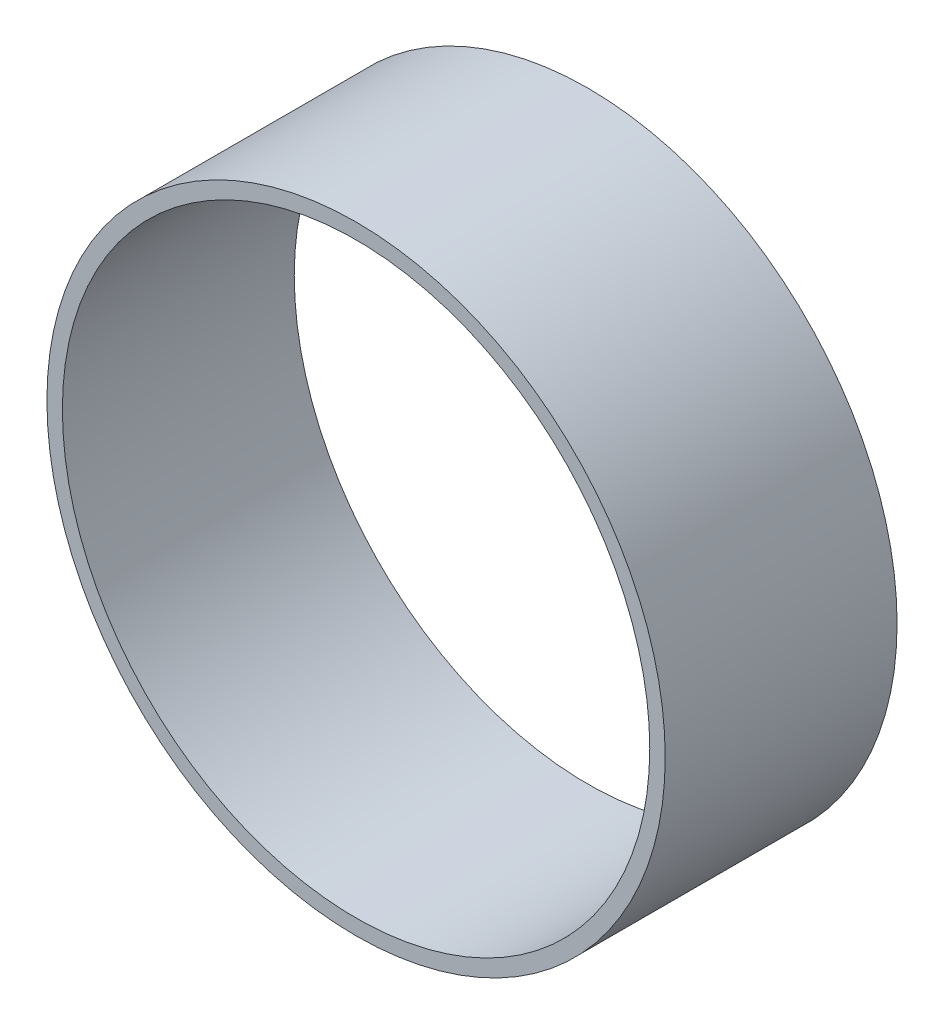
ISO-10303-21;
HEADER;
FILE_DESCRIPTION(('STEP AP214'),'2;1');
FILE_NAME('part.step','',(''),(''),'','','');
FILE_SCHEMA(('AUTOMOTIVE_DESIGN { 1 0 10303 214 1 1 1 1 }'));
ENDSEC;
DATA;
#1=APPLICATION_CONTEXT('core data for automotive mechanical design processes');
#2=APPLICATION_PROTOCOL_DEFINITION('international standard','automotive_design',2000,#1);
#3=PRODUCT_CONTEXT('',#1,'mechanical');
#4=PRODUCT('Part','Part','',(#3));
#5=PRODUCT_RELATED_PRODUCT_CATEGORY('part','',(#4));
#6=PRODUCT_DEFINITION_FORMATION('','',#4);
#7=PRODUCT_DEFINITION_CONTEXT('part definition',#1,'design');
#8=PRODUCT_DEFINITION('design','',#6,#7);
#9=PRODUCT_DEFINITION_SHAPE('','',#8);
#10=(LENGTH_UNIT() NAMED_UNIT(*) SI_UNIT(.MILLI.,.METRE.));
#11=(NAMED_UNIT(*) PLANE_ANGLE_UNIT() SI_UNIT($,.RADIAN.));
#12=(NAMED_UNIT(*) SI_UNIT($,.STERADIAN.) SOLID_ANGLE_UNIT());
#13=UNCERTAINTY_MEASURE_WITH_UNIT(LENGTH_MEASURE(1.E-05),#10,'distance_accuracy_value','');
#14=(GEOMETRIC_REPRESENTATION_CONTEXT(3) GLOBAL_UNCERTAINTY_ASSIGNED_CONTEXT((#13)) GLOBAL_UNIT_ASSIGNED_CONTEXT((#10,
#11,#12)) REPRESENTATION_CONTEXT('',''));
#15=CARTESIAN_POINT('',(0.,0.,0.));
#16=DIRECTION('',(0.,0.,1.));
#17=DIRECTION('',(1.,0.,0.));
#18=AXIS2_PLACEMENT_3D('',#15,#16,#17);
#19=CARTESIAN_POINT('',(0.,0.,30.));
#20=DIRECTION('',(0.,0.,1.));
#21=DIRECTION('',(1.,0.,0.));
#22=AXIS2_PLACEMENT_3D('',#19,#20,#21);
#23=PLANE('',#22);
#24=CARTESIAN_POINT('',(0.,0.,30.));
#25=DIRECTION('',(0.,0.,1.));
#26=DIRECTION('',(1.,0.,0.));
#27=AXIS2_PLACEMENT_3D('',#24,#25,#26);
#28=CIRCLE('',#27,40.);
#29=CARTESIAN_POINT('',(40.,0.,30.));
#30=VERTEX_POINT('',#29);
#31=EDGE_CURVE('E10',#30,#30,#28,.T.);
#32=ORIENTED_EDGE('',*,*,#31,.T.);
#33=EDGE_LOOP('',(#32));
#34=FACE_BOUND('',#33,.T.);
#35=CARTESIAN_POINT('',(0.,0.,30.));
#36=DIRECTION('',(0.,0.,1.));
#37=DIRECTION('',(1.,0.,0.));
#38=AXIS2_PLACEMENT_3D('',#35,#36,#37);
#39=CIRCLE('',#38,38.);
#40=CARTESIAN_POINT('',(38.,0.,30.));
#41=VERTEX_POINT('',#40);
#42=EDGE_CURVE('E42',#41,#41,#39,.T.);
#43=ORIENTED_EDGE('',*,*,#42,.F.);
#44=EDGE_LOOP('',(#43));
#45=FACE_BOUND('',#44,.T.);
#46=ADVANCED_FACE('F31',(#34,#45),#23,.T.);
#47=CARTESIAN_POINT('',(0.,0.,0.));
#48=DIRECTION('',(0.,0.,1.));
#49=DIRECTION('',(1.,0.,0.));
#50=AXIS2_PLACEMENT_3D('',#47,#48,#49);
#51=PLANE('',#50);
#52=CARTESIAN_POINT('',(0.,0.,0.));
#53=DIRECTION('',(0.,0.,1.));
#54=DIRECTION('',(1.,0.,0.));
#55=AXIS2_PLACEMENT_3D('',#52,#53,#54);
#56=CIRCLE('',#55,40.);
#57=CARTESIAN_POINT('',(40.,0.,0.));
#58=VERTEX_POINT('',#57);
#59=EDGE_CURVE('E35',#58,#58,#56,.T.);
#60=ORIENTED_EDGE('',*,*,#59,.F.);
#61=EDGE_LOOP('',(#60));
#62=FACE_BOUND('',#61,.T.);
#63=CARTESIAN_POINT('',(0.,0.,0.));
#64=DIRECTION('',(0.,0.,1.));
#65=DIRECTION('',(1.,0.,0.));
#66=AXIS2_PLACEMENT_3D('',#63,#64,#65);
#67=CIRCLE('',#66,38.);
#68=CARTESIAN_POINT('',(38.,0.,0.));
#69=VERTEX_POINT('',#68);
#70=EDGE_CURVE('E44',#69,#69,#67,.T.);
#71=ORIENTED_EDGE('',*,*,#70,.T.);
#72=EDGE_LOOP('',(#71));
#73=FACE_BOUND('',#72,.T.);
#74=ADVANCED_FACE('F54',(#62,#73),#51,.F.);
#75=CARTESIAN_POINT('',(0.,0.,30.));
#76=DIRECTION('',(0.,0.,-1.));
#77=DIRECTION('',(-1.,0.,0.));
#78=AXIS2_PLACEMENT_3D('',#75,#76,#77);
#79=CYLINDRICAL_SURFACE('',#78,40.);
#80=ORIENTED_EDGE('',*,*,#31,.F.);
#81=EDGE_LOOP('',(#80));
#82=FACE_BOUND('',#81,.T.);
#83=ORIENTED_EDGE('',*,*,#59,.T.);
#84=EDGE_LOOP('',(#83));
#85=FACE_BOUND('',#84,.T.);
#86=ADVANCED_FACE('F33',(#82,#85),#79,.T.);
#87=CARTESIAN_POINT('',(0.,0.,30.));
#88=DIRECTION('',(0.,0.,-1.));
#89=DIRECTION('',(-1.,0.,0.));
#90=AXIS2_PLACEMENT_3D('',#87,#88,#89);
#91=CYLINDRICAL_SURFACE('',#90,38.);
#92=ORIENTED_EDGE('',*,*,#42,.T.);
#93=EDGE_LOOP('',(#92));
#94=FACE_BOUND('',#93,.T.);
#95=ORIENTED_EDGE('',*,*,#70,.F.);
#96=EDGE_LOOP('',(#95));
#97=FACE_BOUND('',#96,.T.);
#98=ADVANCED_FACE('F50',(#94,#97),#91,.F.);
#99=CLOSED_SHELL('',(#46,#74,#86,#98));
#100=MANIFOLD_SOLID_BREP('B2',#99);
#101=ADVANCED_BREP_SHAPE_REPRESENTATION('',(#18,#100),#14);
#102=SHAPE_DEFINITION_REPRESENTATION(#9,#101);
ENDSEC;
END-ISO-10303-21;
